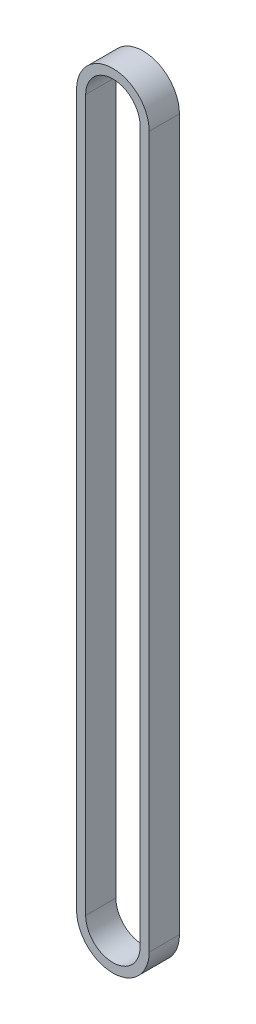
ISO-10303-21;
HEADER;
FILE_DESCRIPTION(('STEP AP214'),'2;1');
FILE_NAME('part.step','',(''),(''),'','','');
FILE_SCHEMA(('AUTOMOTIVE_DESIGN { 1 0 10303 214 1 1 1 1 }'));
ENDSEC;
DATA;
#1=APPLICATION_CONTEXT('core data for automotive mechanical design processes');
#2=APPLICATION_PROTOCOL_DEFINITION('international standard','automotive_design',2000,#1);
#3=PRODUCT_CONTEXT('',#1,'mechanical');
#4=PRODUCT('Part','Part','',(#3));
#5=PRODUCT_RELATED_PRODUCT_CATEGORY('part','',(#4));
#6=PRODUCT_DEFINITION_FORMATION('','',#4);
#7=PRODUCT_DEFINITION_CONTEXT('part definition',#1,'design');
#8=PRODUCT_DEFINITION('design','',#6,#7);
#9=PRODUCT_DEFINITION_SHAPE('','',#8);
#10=(LENGTH_UNIT() NAMED_UNIT(*) SI_UNIT(.MILLI.,.METRE.));
#11=(NAMED_UNIT(*) PLANE_ANGLE_UNIT() SI_UNIT($,.RADIAN.));
#12=(NAMED_UNIT(*) SI_UNIT($,.STERADIAN.) SOLID_ANGLE_UNIT());
#13=UNCERTAINTY_MEASURE_WITH_UNIT(LENGTH_MEASURE(1.E-05),#10,'distance_accuracy_value','');
#14=(GEOMETRIC_REPRESENTATION_CONTEXT(3) GLOBAL_UNCERTAINTY_ASSIGNED_CONTEXT((#13)) GLOBAL_UNIT_ASSIGNED_CONTEXT((#10,
#11,#12)) REPRESENTATION_CONTEXT('',''));
#15=CARTESIAN_POINT('',(0.,0.,0.));
#16=DIRECTION('',(0.,0.,1.));
#17=DIRECTION('',(1.,0.,0.));
#18=AXIS2_PLACEMENT_3D('',#15,#16,#17);
#19=CARTESIAN_POINT('',(0.,0.,10.));
#20=DIRECTION('',(0.,0.,1.));
#21=DIRECTION('',(1.,0.,0.));
#22=AXIS2_PLACEMENT_3D('',#19,#20,#21);
#23=PLANE('',#22);
#24=CARTESIAN_POINT('',(0.,0.,10.));
#25=DIRECTION('',(0.,0.,1.));
#26=DIRECTION('',(1.,0.,0.));
#27=AXIS2_PLACEMENT_3D('',#24,#25,#26);
#28=CIRCLE('',#27,12.);
#29=CARTESIAN_POINT('',(12.,0.,10.));
#30=VERTEX_POINT('',#29);
#31=CARTESIAN_POINT('',(-12.,0.,10.));
#32=VERTEX_POINT('',#31);
#33=EDGE_CURVE('E144',#30,#32,#28,.T.);
#34=ORIENTED_EDGE('',*,*,#33,.T.);
#35=DIRECTION('',(0.,-1.,0.));
#36=VECTOR('',#35,1.);
#37=CARTESIAN_POINT('',(-12.,0.,10.));
#38=LINE('',#37,#36);
#39=CARTESIAN_POINT('',(-12.,-235.,10.));
#40=VERTEX_POINT('',#39);
#41=EDGE_CURVE('E150',#32,#40,#38,.T.);
#42=ORIENTED_EDGE('',*,*,#41,.T.);
#43=CARTESIAN_POINT('',(0.,-235.,10.));
#44=DIRECTION('',(0.,0.,1.));
#45=DIRECTION('',(1.,0.,0.));
#46=AXIS2_PLACEMENT_3D('',#43,#44,#45);
#47=CIRCLE('',#46,12.);
#48=CARTESIAN_POINT('',(12.,-235.,10.));
#49=VERTEX_POINT('',#48);
#50=EDGE_CURVE('E149',#40,#49,#47,.T.);
#51=ORIENTED_EDGE('',*,*,#50,.T.);
#52=DIRECTION('',(0.,1.,0.));
#53=VECTOR('',#52,1.);
#54=CARTESIAN_POINT('',(12.,0.,10.));
#55=LINE('',#54,#53);
#56=EDGE_CURVE('E152',#49,#30,#55,.T.);
#57=ORIENTED_EDGE('',*,*,#56,.T.);
#58=EDGE_LOOP('',(#34,#42,#51,#57));
#59=FACE_BOUND('',#58,.T.);
#60=DIRECTION('',(0.,-1.,0.));
#61=VECTOR('',#60,1.);
#62=CARTESIAN_POINT('',(-9.,0.,10.));
#63=LINE('',#62,#61);
#64=CARTESIAN_POINT('',(-9.,0.,10.));
#65=VERTEX_POINT('',#64);
#66=CARTESIAN_POINT('',(-8.99999999999997,-235.,10.));
#67=VERTEX_POINT('',#66);
#68=EDGE_CURVE('E116',#65,#67,#63,.T.);
#69=ORIENTED_EDGE('',*,*,#68,.F.);
#70=CARTESIAN_POINT('',(0.,0.,10.));
#71=DIRECTION('',(0.,0.,1.));
#72=DIRECTION('',(1.,0.,0.));
#73=AXIS2_PLACEMENT_3D('',#70,#71,#72);
#74=CIRCLE('',#73,9.);
#75=CARTESIAN_POINT('',(9.,0.,10.));
#76=VERTEX_POINT('',#75);
#77=EDGE_CURVE('E108',#76,#65,#74,.T.);
#78=ORIENTED_EDGE('',*,*,#77,.F.);
#79=DIRECTION('',(0.,1.,0.));
#80=VECTOR('',#79,1.);
#81=CARTESIAN_POINT('',(9.,0.,10.));
#82=LINE('',#81,#80);
#83=CARTESIAN_POINT('',(9.00000000000003,-235.,10.));
#84=VERTEX_POINT('',#83);
#85=EDGE_CURVE('E129',#84,#76,#82,.T.);
#86=ORIENTED_EDGE('',*,*,#85,.F.);
#87=CARTESIAN_POINT('',(0.,-235.,10.));
#88=DIRECTION('',(0.,0.,1.));
#89=DIRECTION('',(1.,0.,0.));
#90=AXIS2_PLACEMENT_3D('',#87,#88,#89);
#91=CIRCLE('',#90,9.);
#92=EDGE_CURVE('E127',#67,#84,#91,.T.);
#93=ORIENTED_EDGE('',*,*,#92,.F.);
#94=EDGE_LOOP('',(#69,#78,#86,#93));
#95=FACE_BOUND('',#94,.T.);
#96=ADVANCED_FACE('F43',(#59,#95),#23,.T.);
#97=CARTESIAN_POINT('',(0.,0.,0.));
#98=DIRECTION('',(0.,0.,1.));
#99=DIRECTION('',(1.,0.,0.));
#100=AXIS2_PLACEMENT_3D('',#97,#98,#99);
#101=PLANE('',#100);
#102=CARTESIAN_POINT('',(0.,0.,0.));
#103=DIRECTION('',(0.,0.,1.));
#104=DIRECTION('',(1.,0.,0.));
#105=AXIS2_PLACEMENT_3D('',#102,#103,#104);
#106=CIRCLE('',#105,12.);
#107=CARTESIAN_POINT('',(12.,0.,0.));
#108=VERTEX_POINT('',#107);
#109=CARTESIAN_POINT('',(-12.,0.,0.));
#110=VERTEX_POINT('',#109);
#111=EDGE_CURVE('E121',#108,#110,#106,.T.);
#112=ORIENTED_EDGE('',*,*,#111,.F.);
#113=DIRECTION('',(0.,1.,0.));
#114=VECTOR('',#113,1.);
#115=CARTESIAN_POINT('',(12.,0.,0.));
#116=LINE('',#115,#114);
#117=CARTESIAN_POINT('',(12.,-235.,0.));
#118=VERTEX_POINT('',#117);
#119=EDGE_CURVE('E147',#118,#108,#116,.T.);
#120=ORIENTED_EDGE('',*,*,#119,.F.);
#121=CARTESIAN_POINT('',(0.,-235.,0.));
#122=DIRECTION('',(0.,0.,1.));
#123=DIRECTION('',(1.,0.,0.));
#124=AXIS2_PLACEMENT_3D('',#121,#122,#123);
#125=CIRCLE('',#124,12.);
#126=CARTESIAN_POINT('',(-12.,-235.,0.));
#127=VERTEX_POINT('',#126);
#128=EDGE_CURVE('E156',#127,#118,#125,.T.);
#129=ORIENTED_EDGE('',*,*,#128,.F.);
#130=DIRECTION('',(0.,-1.,0.));
#131=VECTOR('',#130,1.);
#132=CARTESIAN_POINT('',(-12.,0.,0.));
#133=LINE('',#132,#131);
#134=EDGE_CURVE('E160',#110,#127,#133,.T.);
#135=ORIENTED_EDGE('',*,*,#134,.F.);
#136=EDGE_LOOP('',(#112,#120,#129,#135));
#137=FACE_BOUND('',#136,.T.);
#138=CARTESIAN_POINT('',(0.,0.,0.));
#139=DIRECTION('',(0.,0.,1.));
#140=DIRECTION('',(1.,0.,0.));
#141=AXIS2_PLACEMENT_3D('',#138,#139,#140);
#142=CIRCLE('',#141,9.);
#143=CARTESIAN_POINT('',(9.,0.,0.));
#144=VERTEX_POINT('',#143);
#145=CARTESIAN_POINT('',(-9.,0.,0.));
#146=VERTEX_POINT('',#145);
#147=EDGE_CURVE('E66',#144,#146,#142,.T.);
#148=ORIENTED_EDGE('',*,*,#147,.T.);
#149=DIRECTION('',(0.,-1.,0.));
#150=VECTOR('',#149,1.);
#151=CARTESIAN_POINT('',(-9.,0.,0.));
#152=LINE('',#151,#150);
#153=CARTESIAN_POINT('',(-8.99999999999997,-235.,0.));
#154=VERTEX_POINT('',#153);
#155=EDGE_CURVE('E124',#146,#154,#152,.T.);
#156=ORIENTED_EDGE('',*,*,#155,.T.);
#157=CARTESIAN_POINT('',(0.,-235.,0.));
#158=DIRECTION('',(0.,0.,1.));
#159=DIRECTION('',(1.,0.,0.));
#160=AXIS2_PLACEMENT_3D('',#157,#158,#159);
#161=CIRCLE('',#160,9.);
#162=CARTESIAN_POINT('',(9.00000000000003,-235.,0.));
#163=VERTEX_POINT('',#162);
#164=EDGE_CURVE('E137',#154,#163,#161,.T.);
#165=ORIENTED_EDGE('',*,*,#164,.T.);
#166=DIRECTION('',(0.,1.,0.));
#167=VECTOR('',#166,1.);
#168=CARTESIAN_POINT('',(9.,0.,0.));
#169=LINE('',#168,#167);
#170=EDGE_CURVE('E120',#163,#144,#169,.T.);
#171=ORIENTED_EDGE('',*,*,#170,.T.);
#172=EDGE_LOOP('',(#148,#156,#165,#171));
#173=FACE_BOUND('',#172,.T.);
#174=ADVANCED_FACE('F180',(#137,#173),#101,.F.);
#175=CARTESIAN_POINT('',(0.,0.,10.));
#176=DIRECTION('',(0.,0.,-1.));
#177=DIRECTION('',(-1.,0.,0.));
#178=AXIS2_PLACEMENT_3D('',#175,#176,#177);
#179=CYLINDRICAL_SURFACE('',#178,12.);
#180=ORIENTED_EDGE('',*,*,#111,.T.);
#181=DIRECTION('',(0.,0.,-1.));
#182=VECTOR('',#181,1.);
#183=CARTESIAN_POINT('',(-12.,0.,10.));
#184=LINE('',#183,#182);
#185=EDGE_CURVE('E11',#32,#110,#184,.T.);
#186=ORIENTED_EDGE('',*,*,#185,.F.);
#187=ORIENTED_EDGE('',*,*,#33,.F.);
#188=DIRECTION('',(0.,0.,-1.));
#189=VECTOR('',#188,1.);
#190=CARTESIAN_POINT('',(12.,0.,10.));
#191=LINE('',#190,#189);
#192=EDGE_CURVE('E153',#30,#108,#191,.T.);
#193=ORIENTED_EDGE('',*,*,#192,.T.);
#194=EDGE_LOOP('',(#180,#186,#187,#193));
#195=FACE_BOUND('',#194,.T.);
#196=ADVANCED_FACE('F44',(#195),#179,.T.);
#197=CARTESIAN_POINT('',(-12.,0.,10.));
#198=DIRECTION('',(1.,0.,0.));
#199=DIRECTION('',(0.,1.,0.));
#200=AXIS2_PLACEMENT_3D('',#197,#198,#199);
#201=PLANE('',#200);
#202=ORIENTED_EDGE('',*,*,#134,.T.);
#203=DIRECTION('',(0.,0.,-1.));
#204=VECTOR('',#203,1.);
#205=CARTESIAN_POINT('',(-12.,-235.,10.));
#206=LINE('',#205,#204);
#207=EDGE_CURVE('E51',#40,#127,#206,.T.);
#208=ORIENTED_EDGE('',*,*,#207,.F.);
#209=ORIENTED_EDGE('',*,*,#41,.F.);
#210=ORIENTED_EDGE('',*,*,#185,.T.);
#211=EDGE_LOOP('',(#202,#208,#209,#210));
#212=FACE_BOUND('',#211,.T.);
#213=ADVANCED_FACE('F190',(#212),#201,.F.);
#214=CARTESIAN_POINT('',(0.,-235.,10.));
#215=DIRECTION('',(0.,0.,-1.));
#216=DIRECTION('',(-1.,0.,0.));
#217=AXIS2_PLACEMENT_3D('',#214,#215,#216);
#218=CYLINDRICAL_SURFACE('',#217,12.);
#219=ORIENTED_EDGE('',*,*,#128,.T.);
#220=DIRECTION('',(0.,0.,-1.));
#221=VECTOR('',#220,1.);
#222=CARTESIAN_POINT('',(12.,-235.,10.));
#223=LINE('',#222,#221);
#224=EDGE_CURVE('E165',#49,#118,#223,.T.);
#225=ORIENTED_EDGE('',*,*,#224,.F.);
#226=ORIENTED_EDGE('',*,*,#50,.F.);
#227=ORIENTED_EDGE('',*,*,#207,.T.);
#228=EDGE_LOOP('',(#219,#225,#226,#227));
#229=FACE_BOUND('',#228,.T.);
#230=ADVANCED_FACE('F171',(#229),#218,.T.);
#231=CARTESIAN_POINT('',(12.,0.,10.));
#232=DIRECTION('',(-1.,0.,0.));
#233=DIRECTION('',(0.,-1.,0.));
#234=AXIS2_PLACEMENT_3D('',#231,#232,#233);
#235=PLANE('',#234);
#236=ORIENTED_EDGE('',*,*,#119,.T.);
#237=ORIENTED_EDGE('',*,*,#192,.F.);
#238=ORIENTED_EDGE('',*,*,#56,.F.);
#239=ORIENTED_EDGE('',*,*,#224,.T.);
#240=EDGE_LOOP('',(#236,#237,#238,#239));
#241=FACE_BOUND('',#240,.T.);
#242=ADVANCED_FACE('F181',(#241),#235,.F.);
#243=CARTESIAN_POINT('',(0.,0.,10.));
#244=DIRECTION('',(0.,0.,-1.));
#245=DIRECTION('',(-1.,0.,0.));
#246=AXIS2_PLACEMENT_3D('',#243,#244,#245);
#247=CYLINDRICAL_SURFACE('',#246,9.);
#248=ORIENTED_EDGE('',*,*,#147,.F.);
#249=DIRECTION('',(0.,0.,-1.));
#250=VECTOR('',#249,1.);
#251=CARTESIAN_POINT('',(9.,0.,10.));
#252=LINE('',#251,#250);
#253=EDGE_CURVE('E115',#76,#144,#252,.T.);
#254=ORIENTED_EDGE('',*,*,#253,.F.);
#255=ORIENTED_EDGE('',*,*,#77,.T.);
#256=DIRECTION('',(0.,0.,-1.));
#257=VECTOR('',#256,1.);
#258=CARTESIAN_POINT('',(-9.,0.,10.));
#259=LINE('',#258,#257);
#260=EDGE_CURVE('E111',#65,#146,#259,.T.);
#261=ORIENTED_EDGE('',*,*,#260,.T.);
#262=EDGE_LOOP('',(#248,#254,#255,#261));
#263=FACE_BOUND('',#262,.T.);
#264=ADVANCED_FACE('F109',(#263),#247,.F.);
#265=CARTESIAN_POINT('',(-9.,0.,10.));
#266=DIRECTION('',(1.,0.,0.));
#267=DIRECTION('',(0.,1.,0.));
#268=AXIS2_PLACEMENT_3D('',#265,#266,#267);
#269=PLANE('',#268);
#270=ORIENTED_EDGE('',*,*,#155,.F.);
#271=ORIENTED_EDGE('',*,*,#260,.F.);
#272=ORIENTED_EDGE('',*,*,#68,.T.);
#273=DIRECTION('',(0.,0.,-1.));
#274=VECTOR('',#273,1.);
#275=CARTESIAN_POINT('',(-8.99999999999997,-235.,10.));
#276=LINE('',#275,#274);
#277=EDGE_CURVE('E123',#67,#154,#276,.T.);
#278=ORIENTED_EDGE('',*,*,#277,.T.);
#279=EDGE_LOOP('',(#270,#271,#272,#278));
#280=FACE_BOUND('',#279,.T.);
#281=ADVANCED_FACE('F119',(#280),#269,.T.);
#282=CARTESIAN_POINT('',(0.,-235.,10.));
#283=DIRECTION('',(0.,0.,-1.));
#284=DIRECTION('',(-1.,0.,0.));
#285=AXIS2_PLACEMENT_3D('',#282,#283,#284);
#286=CYLINDRICAL_SURFACE('',#285,9.);
#287=ORIENTED_EDGE('',*,*,#164,.F.);
#288=ORIENTED_EDGE('',*,*,#277,.F.);
#289=ORIENTED_EDGE('',*,*,#92,.T.);
#290=DIRECTION('',(0.,0.,-1.));
#291=VECTOR('',#290,1.);
#292=CARTESIAN_POINT('',(9.00000000000003,-235.,10.));
#293=LINE('',#292,#291);
#294=EDGE_CURVE('E59',#84,#163,#293,.T.);
#295=ORIENTED_EDGE('',*,*,#294,.T.);
#296=EDGE_LOOP('',(#287,#288,#289,#295));
#297=FACE_BOUND('',#296,.T.);
#298=ADVANCED_FACE('F208',(#297),#286,.F.);
#299=CARTESIAN_POINT('',(9.,0.,10.));
#300=DIRECTION('',(-1.,0.,0.));
#301=DIRECTION('',(0.,-1.,0.));
#302=AXIS2_PLACEMENT_3D('',#299,#300,#301);
#303=PLANE('',#302);
#304=ORIENTED_EDGE('',*,*,#170,.F.);
#305=ORIENTED_EDGE('',*,*,#294,.F.);
#306=ORIENTED_EDGE('',*,*,#85,.T.);
#307=ORIENTED_EDGE('',*,*,#253,.T.);
#308=EDGE_LOOP('',(#304,#305,#306,#307));
#309=FACE_BOUND('',#308,.T.);
#310=ADVANCED_FACE('F213',(#309),#303,.T.);
#311=CLOSED_SHELL('',(#96,#174,#196,#213,#230,#242,#264,#281,#298,#310));
#312=MANIFOLD_SOLID_BREP('B2',#311);
#313=ADVANCED_BREP_SHAPE_REPRESENTATION('',(#18,#312),#14);
#314=SHAPE_DEFINITION_REPRESENTATION(#9,#313);
ENDSEC;
END-ISO-10303-21;
